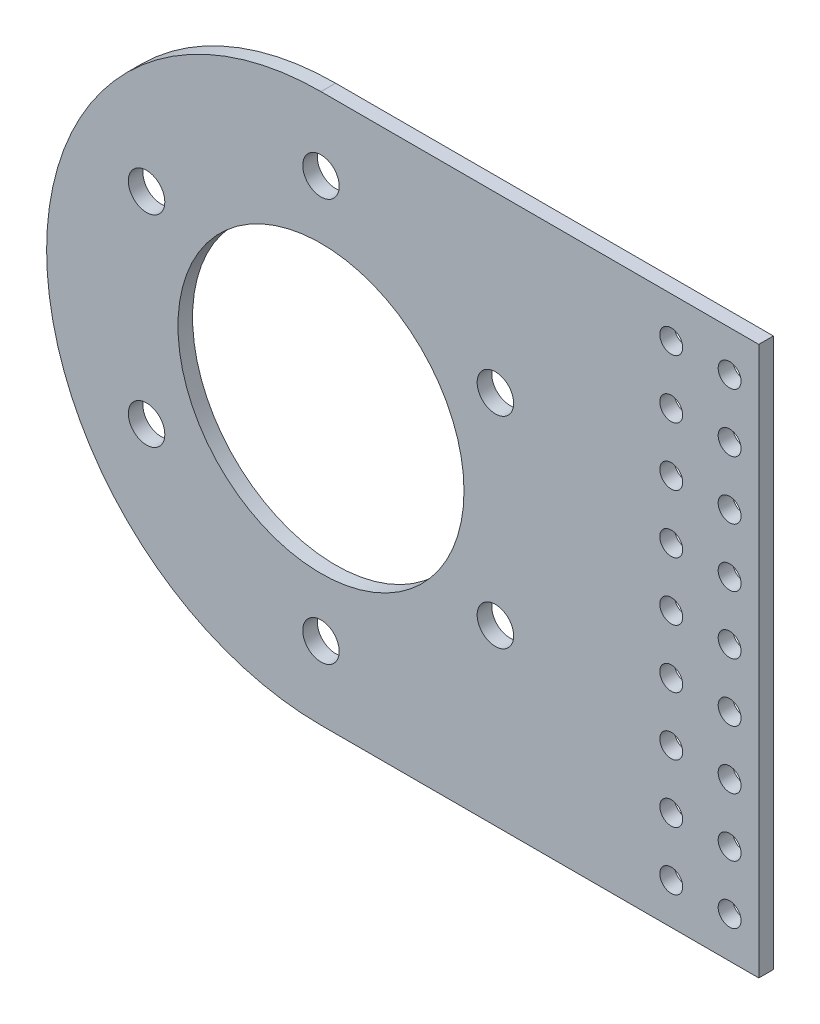
ISO-10303-21;
HEADER;
FILE_DESCRIPTION(('STEP AP214'),'2;1');
FILE_NAME('part.step','',(''),(''),'','','');
FILE_SCHEMA(('AUTOMOTIVE_DESIGN { 1 0 10303 214 1 1 1 1 }'));
ENDSEC;
DATA;
#1=APPLICATION_CONTEXT('core data for automotive mechanical design processes');
#2=APPLICATION_PROTOCOL_DEFINITION('international standard','automotive_design',2000,#1);
#3=PRODUCT_CONTEXT('',#1,'mechanical');
#4=PRODUCT('Part','Part','',(#3));
#5=PRODUCT_RELATED_PRODUCT_CATEGORY('part','',(#4));
#6=PRODUCT_DEFINITION_FORMATION('','',#4);
#7=PRODUCT_DEFINITION_CONTEXT('part definition',#1,'design');
#8=PRODUCT_DEFINITION('design','',#6,#7);
#9=PRODUCT_DEFINITION_SHAPE('','',#8);
#10=(LENGTH_UNIT() NAMED_UNIT(*) SI_UNIT(.MILLI.,.METRE.));
#11=(NAMED_UNIT(*) PLANE_ANGLE_UNIT() SI_UNIT($,.RADIAN.));
#12=(NAMED_UNIT(*) SI_UNIT($,.STERADIAN.) SOLID_ANGLE_UNIT());
#13=UNCERTAINTY_MEASURE_WITH_UNIT(LENGTH_MEASURE(1.E-05),#10,'distance_accuracy_value','');
#14=(GEOMETRIC_REPRESENTATION_CONTEXT(3) GLOBAL_UNCERTAINTY_ASSIGNED_CONTEXT((#13)) GLOBAL_UNIT_ASSIGNED_CONTEXT((#10,
#11,#12)) REPRESENTATION_CONTEXT('',''));
#15=CARTESIAN_POINT('',(0.,0.,0.));
#16=DIRECTION('',(0.,0.,1.));
#17=DIRECTION('',(1.,0.,0.));
#18=AXIS2_PLACEMENT_3D('',#15,#16,#17);
#19=CARTESIAN_POINT('',(0.,0.,3.175));
#20=DIRECTION('',(0.,0.,1.));
#21=DIRECTION('',(1.,0.,0.));
#22=AXIS2_PLACEMENT_3D('',#19,#20,#21);
#23=PLANE('',#22);
#24=CARTESIAN_POINT('',(37.9449030668154,21.9074999999996,3.175));
#25=DIRECTION('',(0.,0.,1.));
#26=DIRECTION('',(1.,0.,0.));
#27=AXIS2_PLACEMENT_3D('',#24,#25,#26);
#28=CIRCLE('',#27,3.96875);
#29=CARTESIAN_POINT('',(41.9136530668154,21.9074999999996,3.175));
#30=VERTEX_POINT('',#29);
#31=EDGE_CURVE('E331',#30,#30,#28,.T.);
#32=ORIENTED_EDGE('',*,*,#31,.F.);
#33=EDGE_LOOP('',(#32));
#34=FACE_BOUND('',#33,.T.);
#35=CARTESIAN_POINT('',(37.9449030668149,-21.9075000000004,3.175));
#36=DIRECTION('',(0.,0.,1.));
#37=DIRECTION('',(1.,0.,0.));
#38=AXIS2_PLACEMENT_3D('',#35,#36,#37);
#39=CIRCLE('',#38,3.96875);
#40=CARTESIAN_POINT('',(41.9136530668149,-21.9075000000004,3.175));
#41=VERTEX_POINT('',#40);
#42=EDGE_CURVE('E323',#41,#41,#39,.T.);
#43=ORIENTED_EDGE('',*,*,#42,.F.);
#44=EDGE_LOOP('',(#43));
#45=FACE_BOUND('',#44,.T.);
#46=CARTESIAN_POINT('',(0.,-43.815,3.175));
#47=DIRECTION('',(0.,0.,1.));
#48=DIRECTION('',(1.,0.,0.));
#49=AXIS2_PLACEMENT_3D('',#46,#47,#48);
#50=CIRCLE('',#49,3.96875);
#51=CARTESIAN_POINT('',(3.96875,-43.815,3.175));
#52=VERTEX_POINT('',#51);
#53=EDGE_CURVE('E315',#52,#52,#50,.T.);
#54=ORIENTED_EDGE('',*,*,#53,.F.);
#55=EDGE_LOOP('',(#54));
#56=FACE_BOUND('',#55,.T.);
#57=CARTESIAN_POINT('',(-37.9449030668152,-21.9074999999999,3.175));
#58=DIRECTION('',(0.,0.,1.));
#59=DIRECTION('',(1.,0.,0.));
#60=AXIS2_PLACEMENT_3D('',#57,#58,#59);
#61=CIRCLE('',#60,3.96875);
#62=CARTESIAN_POINT('',(-33.9761530668152,-21.9074999999999,3.175));
#63=VERTEX_POINT('',#62);
#64=EDGE_CURVE('E307',#63,#63,#61,.T.);
#65=ORIENTED_EDGE('',*,*,#64,.F.);
#66=EDGE_LOOP('',(#65));
#67=FACE_BOUND('',#66,.T.);
#68=CARTESIAN_POINT('',(-37.9449030668151,21.9075000000002,3.175));
#69=DIRECTION('',(0.,0.,1.));
#70=DIRECTION('',(1.,0.,0.));
#71=AXIS2_PLACEMENT_3D('',#68,#69,#70);
#72=CIRCLE('',#71,3.96875);
#73=CARTESIAN_POINT('',(-33.9761530668151,21.9075000000002,3.175));
#74=VERTEX_POINT('',#73);
#75=EDGE_CURVE('E299',#74,#74,#72,.T.);
#76=ORIENTED_EDGE('',*,*,#75,.F.);
#77=EDGE_LOOP('',(#76));
#78=FACE_BOUND('',#77,.T.);
#79=CARTESIAN_POINT('',(3.05958509722824E-13,43.815,3.175));
#80=DIRECTION('',(0.,0.,1.));
#81=DIRECTION('',(1.,0.,0.));
#82=AXIS2_PLACEMENT_3D('',#79,#80,#81);
#83=CIRCLE('',#82,3.96875);
#84=CARTESIAN_POINT('',(3.96875000000031,43.815,3.175));
#85=VERTEX_POINT('',#84);
#86=EDGE_CURVE('E291',#85,#85,#83,.T.);
#87=ORIENTED_EDGE('',*,*,#86,.F.);
#88=EDGE_LOOP('',(#87));
#89=FACE_BOUND('',#88,.T.);
#90=CARTESIAN_POINT('',(88.9,-50.8,3.175));
#91=DIRECTION('',(0.,0.,1.));
#92=DIRECTION('',(1.,0.,0.));
#93=AXIS2_PLACEMENT_3D('',#90,#91,#92);
#94=CIRCLE('',#93,2.4892);
#95=CARTESIAN_POINT('',(91.3892,-50.8,3.175));
#96=VERTEX_POINT('',#95);
#97=EDGE_CURVE('E283',#96,#96,#94,.T.);
#98=ORIENTED_EDGE('',*,*,#97,.F.);
#99=EDGE_LOOP('',(#98));
#100=FACE_BOUND('',#99,.T.);
#101=CARTESIAN_POINT('',(76.2,-50.8000000000001,3.175));
#102=DIRECTION('',(0.,0.,1.));
#103=DIRECTION('',(1.,0.,0.));
#104=AXIS2_PLACEMENT_3D('',#101,#102,#103);
#105=CIRCLE('',#104,2.4892);
#106=CARTESIAN_POINT('',(78.6892,-50.8000000000001,3.175));
#107=VERTEX_POINT('',#106);
#108=EDGE_CURVE('E275',#107,#107,#105,.T.);
#109=ORIENTED_EDGE('',*,*,#108,.F.);
#110=EDGE_LOOP('',(#109));
#111=FACE_BOUND('',#110,.T.);
#112=CARTESIAN_POINT('',(76.2,-38.1000000000001,3.175));
#113=DIRECTION('',(0.,0.,1.));
#114=DIRECTION('',(1.,0.,0.));
#115=AXIS2_PLACEMENT_3D('',#112,#113,#114);
#116=CIRCLE('',#115,2.4892);
#117=CARTESIAN_POINT('',(78.6892,-38.1000000000001,3.175));
#118=VERTEX_POINT('',#117);
#119=EDGE_CURVE('E267',#118,#118,#116,.T.);
#120=ORIENTED_EDGE('',*,*,#119,.F.);
#121=EDGE_LOOP('',(#120));
#122=FACE_BOUND('',#121,.T.);
#123=CARTESIAN_POINT('',(76.2,-25.4000000000001,3.175));
#124=DIRECTION('',(0.,0.,1.));
#125=DIRECTION('',(1.,0.,0.));
#126=AXIS2_PLACEMENT_3D('',#123,#124,#125);
#127=CIRCLE('',#126,2.4892);
#128=CARTESIAN_POINT('',(78.6892,-25.4000000000001,3.175));
#129=VERTEX_POINT('',#128);
#130=EDGE_CURVE('E259',#129,#129,#127,.T.);
#131=ORIENTED_EDGE('',*,*,#130,.F.);
#132=EDGE_LOOP('',(#131));
#133=FACE_BOUND('',#132,.T.);
#134=CARTESIAN_POINT('',(76.2,-12.7000000000001,3.175));
#135=DIRECTION('',(0.,0.,1.));
#136=DIRECTION('',(1.,0.,0.));
#137=AXIS2_PLACEMENT_3D('',#134,#135,#136);
#138=CIRCLE('',#137,2.4892);
#139=CARTESIAN_POINT('',(78.6892,-12.7000000000001,3.175));
#140=VERTEX_POINT('',#139);
#141=EDGE_CURVE('E251',#140,#140,#138,.T.);
#142=ORIENTED_EDGE('',*,*,#141,.F.);
#143=EDGE_LOOP('',(#142));
#144=FACE_BOUND('',#143,.T.);
#145=CARTESIAN_POINT('',(76.2,0.,3.175));
#146=DIRECTION('',(0.,0.,1.));
#147=DIRECTION('',(1.,0.,0.));
#148=AXIS2_PLACEMENT_3D('',#145,#146,#147);
#149=CIRCLE('',#148,2.4892);
#150=CARTESIAN_POINT('',(78.6892,0.,3.175));
#151=VERTEX_POINT('',#150);
#152=EDGE_CURVE('E243',#151,#151,#149,.T.);
#153=ORIENTED_EDGE('',*,*,#152,.F.);
#154=EDGE_LOOP('',(#153));
#155=FACE_BOUND('',#154,.T.);
#156=CARTESIAN_POINT('',(76.2,12.6999999999999,3.175));
#157=DIRECTION('',(0.,0.,1.));
#158=DIRECTION('',(1.,0.,0.));
#159=AXIS2_PLACEMENT_3D('',#156,#157,#158);
#160=CIRCLE('',#159,2.4892);
#161=CARTESIAN_POINT('',(78.6892,12.6999999999999,3.175));
#162=VERTEX_POINT('',#161);
#163=EDGE_CURVE('E235',#162,#162,#160,.T.);
#164=ORIENTED_EDGE('',*,*,#163,.F.);
#165=EDGE_LOOP('',(#164));
#166=FACE_BOUND('',#165,.T.);
#167=CARTESIAN_POINT('',(76.2,25.3999999999999,3.175));
#168=DIRECTION('',(0.,0.,1.));
#169=DIRECTION('',(1.,0.,0.));
#170=AXIS2_PLACEMENT_3D('',#167,#168,#169);
#171=CIRCLE('',#170,2.4892);
#172=CARTESIAN_POINT('',(78.6892,25.3999999999999,3.175));
#173=VERTEX_POINT('',#172);
#174=EDGE_CURVE('E227',#173,#173,#171,.T.);
#175=ORIENTED_EDGE('',*,*,#174,.F.);
#176=EDGE_LOOP('',(#175));
#177=FACE_BOUND('',#176,.T.);
#178=CARTESIAN_POINT('',(76.2,38.0999999999999,3.175));
#179=DIRECTION('',(0.,0.,1.));
#180=DIRECTION('',(1.,0.,0.));
#181=AXIS2_PLACEMENT_3D('',#178,#179,#180);
#182=CIRCLE('',#181,2.4892);
#183=CARTESIAN_POINT('',(78.6892,38.0999999999999,3.175));
#184=VERTEX_POINT('',#183);
#185=EDGE_CURVE('E219',#184,#184,#182,.T.);
#186=ORIENTED_EDGE('',*,*,#185,.F.);
#187=EDGE_LOOP('',(#186));
#188=FACE_BOUND('',#187,.T.);
#189=CARTESIAN_POINT('',(76.2,50.7999999999999,3.175));
#190=DIRECTION('',(0.,0.,1.));
#191=DIRECTION('',(1.,0.,0.));
#192=AXIS2_PLACEMENT_3D('',#189,#190,#191);
#193=CIRCLE('',#192,2.4892);
#194=CARTESIAN_POINT('',(78.6892,50.7999999999999,3.175));
#195=VERTEX_POINT('',#194);
#196=EDGE_CURVE('E211',#195,#195,#193,.T.);
#197=ORIENTED_EDGE('',*,*,#196,.F.);
#198=EDGE_LOOP('',(#197));
#199=FACE_BOUND('',#198,.T.);
#200=CARTESIAN_POINT('',(88.9,-38.1,3.175));
#201=DIRECTION('',(0.,0.,1.));
#202=DIRECTION('',(1.,0.,0.));
#203=AXIS2_PLACEMENT_3D('',#200,#201,#202);
#204=CIRCLE('',#203,2.4892);
#205=CARTESIAN_POINT('',(91.3892,-38.1,3.175));
#206=VERTEX_POINT('',#205);
#207=EDGE_CURVE('E203',#206,#206,#204,.T.);
#208=ORIENTED_EDGE('',*,*,#207,.F.);
#209=EDGE_LOOP('',(#208));
#210=FACE_BOUND('',#209,.T.);
#211=CARTESIAN_POINT('',(88.9,-25.4,3.175));
#212=DIRECTION('',(0.,0.,1.));
#213=DIRECTION('',(1.,0.,0.));
#214=AXIS2_PLACEMENT_3D('',#211,#212,#213);
#215=CIRCLE('',#214,2.4892);
#216=CARTESIAN_POINT('',(91.3892,-25.4,3.175));
#217=VERTEX_POINT('',#216);
#218=EDGE_CURVE('E195',#217,#217,#215,.T.);
#219=ORIENTED_EDGE('',*,*,#218,.F.);
#220=EDGE_LOOP('',(#219));
#221=FACE_BOUND('',#220,.T.);
#222=CARTESIAN_POINT('',(88.9,-12.7,3.175));
#223=DIRECTION('',(0.,0.,1.));
#224=DIRECTION('',(1.,0.,0.));
#225=AXIS2_PLACEMENT_3D('',#222,#223,#224);
#226=CIRCLE('',#225,2.4892);
#227=CARTESIAN_POINT('',(91.3892,-12.7,3.175));
#228=VERTEX_POINT('',#227);
#229=EDGE_CURVE('E187',#228,#228,#226,.T.);
#230=ORIENTED_EDGE('',*,*,#229,.F.);
#231=EDGE_LOOP('',(#230));
#232=FACE_BOUND('',#231,.T.);
#233=CARTESIAN_POINT('',(88.9,0.,3.175));
#234=DIRECTION('',(0.,0.,1.));
#235=DIRECTION('',(1.,0.,0.));
#236=AXIS2_PLACEMENT_3D('',#233,#234,#235);
#237=CIRCLE('',#236,2.4892);
#238=CARTESIAN_POINT('',(91.3892,0.,3.175));
#239=VERTEX_POINT('',#238);
#240=EDGE_CURVE('E179',#239,#239,#237,.T.);
#241=ORIENTED_EDGE('',*,*,#240,.F.);
#242=EDGE_LOOP('',(#241));
#243=FACE_BOUND('',#242,.T.);
#244=CARTESIAN_POINT('',(88.9,12.7,3.175));
#245=DIRECTION('',(0.,0.,1.));
#246=DIRECTION('',(1.,0.,0.));
#247=AXIS2_PLACEMENT_3D('',#244,#245,#246);
#248=CIRCLE('',#247,2.4892);
#249=CARTESIAN_POINT('',(91.3892,12.7,3.175));
#250=VERTEX_POINT('',#249);
#251=EDGE_CURVE('E171',#250,#250,#248,.T.);
#252=ORIENTED_EDGE('',*,*,#251,.F.);
#253=EDGE_LOOP('',(#252));
#254=FACE_BOUND('',#253,.T.);
#255=CARTESIAN_POINT('',(88.9,25.4,3.175));
#256=DIRECTION('',(0.,0.,1.));
#257=DIRECTION('',(1.,0.,0.));
#258=AXIS2_PLACEMENT_3D('',#255,#256,#257);
#259=CIRCLE('',#258,2.4892);
#260=CARTESIAN_POINT('',(91.3892,25.4,3.175));
#261=VERTEX_POINT('',#260);
#262=EDGE_CURVE('E163',#261,#261,#259,.T.);
#263=ORIENTED_EDGE('',*,*,#262,.F.);
#264=EDGE_LOOP('',(#263));
#265=FACE_BOUND('',#264,.T.);
#266=CARTESIAN_POINT('',(88.9,38.1,3.175));
#267=DIRECTION('',(0.,0.,1.));
#268=DIRECTION('',(1.,0.,0.));
#269=AXIS2_PLACEMENT_3D('',#266,#267,#268);
#270=CIRCLE('',#269,2.4892);
#271=CARTESIAN_POINT('',(91.3892,38.1,3.175));
#272=VERTEX_POINT('',#271);
#273=EDGE_CURVE('E155',#272,#272,#270,.T.);
#274=ORIENTED_EDGE('',*,*,#273,.F.);
#275=EDGE_LOOP('',(#274));
#276=FACE_BOUND('',#275,.T.);
#277=CARTESIAN_POINT('',(88.9,50.8,3.175));
#278=DIRECTION('',(0.,0.,1.));
#279=DIRECTION('',(1.,0.,0.));
#280=AXIS2_PLACEMENT_3D('',#277,#278,#279);
#281=CIRCLE('',#280,2.4892);
#282=CARTESIAN_POINT('',(91.3892,50.8,3.175));
#283=VERTEX_POINT('',#282);
#284=EDGE_CURVE('E147',#283,#283,#281,.T.);
#285=ORIENTED_EDGE('',*,*,#284,.F.);
#286=EDGE_LOOP('',(#285));
#287=FACE_BOUND('',#286,.T.);
#288=CARTESIAN_POINT('',(0.,0.,3.175));
#289=DIRECTION('',(0.,0.,1.));
#290=DIRECTION('',(1.,0.,0.));
#291=AXIS2_PLACEMENT_3D('',#288,#289,#290);
#292=CIRCLE('',#291,59.69);
#293=CARTESIAN_POINT('',(0.,59.69,3.175));
#294=VERTEX_POINT('',#293);
#295=CARTESIAN_POINT('',(0.,-59.69,3.175));
#296=VERTEX_POINT('',#295);
#297=EDGE_CURVE('E98',#294,#296,#292,.T.);
#298=ORIENTED_EDGE('',*,*,#297,.T.);
#299=DIRECTION('',(1.,0.,0.));
#300=VECTOR('',#299,1.);
#301=CARTESIAN_POINT('',(0.,-59.69,3.175));
#302=LINE('',#301,#300);
#303=CARTESIAN_POINT('',(95.25,-59.69,3.175));
#304=VERTEX_POINT('',#303);
#305=EDGE_CURVE('E93',#296,#304,#302,.T.);
#306=ORIENTED_EDGE('',*,*,#305,.T.);
#307=DIRECTION('',(0.,1.,0.));
#308=VECTOR('',#307,1.);
#309=CARTESIAN_POINT('',(95.25,-59.69,3.175));
#310=LINE('',#309,#308);
#311=CARTESIAN_POINT('',(95.25,59.69,3.175));
#312=VERTEX_POINT('',#311);
#313=EDGE_CURVE('E96',#304,#312,#310,.T.);
#314=ORIENTED_EDGE('',*,*,#313,.T.);
#315=DIRECTION('',(-1.,0.,0.));
#316=VECTOR('',#315,1.);
#317=CARTESIAN_POINT('',(95.25,59.69,3.175));
#318=LINE('',#317,#316);
#319=EDGE_CURVE('E63',#312,#294,#318,.T.);
#320=ORIENTED_EDGE('',*,*,#319,.T.);
#321=EDGE_LOOP('',(#298,#306,#314,#320));
#322=FACE_BOUND('',#321,.T.);
#323=CARTESIAN_POINT('',(0.,0.,3.175));
#324=DIRECTION('',(0.,0.,1.));
#325=DIRECTION('',(1.,0.,0.));
#326=AXIS2_PLACEMENT_3D('',#323,#324,#325);
#327=CIRCLE('',#326,31.115);
#328=CARTESIAN_POINT('',(31.115,0.,3.175));
#329=VERTEX_POINT('',#328);
#330=EDGE_CURVE('E118',#329,#329,#327,.T.);
#331=ORIENTED_EDGE('',*,*,#330,.F.);
#332=EDGE_LOOP('',(#331));
#333=FACE_BOUND('',#332,.T.);
#334=ADVANCED_FACE('F45',(#34,#45,#56,#67,#78,#89,#100,#111,#122,#133,#144,#155,#166,#177,#188,
#199,#210,#221,#232,#243,#254,#265,#276,#287,#322,#333),#23,.T.);
#335=CARTESIAN_POINT('',(0.,0.,0.));
#336=DIRECTION('',(0.,0.,1.));
#337=DIRECTION('',(1.,0.,0.));
#338=AXIS2_PLACEMENT_3D('',#335,#336,#337);
#339=PLANE('',#338);
#340=CARTESIAN_POINT('',(37.9449030668154,21.9074999999996,0.));
#341=DIRECTION('',(0.,0.,1.));
#342=DIRECTION('',(1.,0.,0.));
#343=AXIS2_PLACEMENT_3D('',#340,#341,#342);
#344=CIRCLE('',#343,3.96875);
#345=CARTESIAN_POINT('',(41.9136530668154,21.9074999999996,0.));
#346=VERTEX_POINT('',#345);
#347=EDGE_CURVE('E327',#346,#346,#344,.T.);
#348=ORIENTED_EDGE('',*,*,#347,.T.);
#349=EDGE_LOOP('',(#348));
#350=FACE_BOUND('',#349,.T.);
#351=CARTESIAN_POINT('',(37.9449030668149,-21.9075000000004,0.));
#352=DIRECTION('',(0.,0.,1.));
#353=DIRECTION('',(1.,0.,0.));
#354=AXIS2_PLACEMENT_3D('',#351,#352,#353);
#355=CIRCLE('',#354,3.96875);
#356=CARTESIAN_POINT('',(41.9136530668149,-21.9075000000004,0.));
#357=VERTEX_POINT('',#356);
#358=EDGE_CURVE('E319',#357,#357,#355,.T.);
#359=ORIENTED_EDGE('',*,*,#358,.T.);
#360=EDGE_LOOP('',(#359));
#361=FACE_BOUND('',#360,.T.);
#362=CARTESIAN_POINT('',(0.,-43.815,0.));
#363=DIRECTION('',(0.,0.,1.));
#364=DIRECTION('',(1.,0.,0.));
#365=AXIS2_PLACEMENT_3D('',#362,#363,#364);
#366=CIRCLE('',#365,3.96875);
#367=CARTESIAN_POINT('',(3.96875,-43.815,0.));
#368=VERTEX_POINT('',#367);
#369=EDGE_CURVE('E311',#368,#368,#366,.T.);
#370=ORIENTED_EDGE('',*,*,#369,.T.);
#371=EDGE_LOOP('',(#370));
#372=FACE_BOUND('',#371,.T.);
#373=CARTESIAN_POINT('',(-37.9449030668152,-21.9074999999999,0.));
#374=DIRECTION('',(0.,0.,1.));
#375=DIRECTION('',(1.,0.,0.));
#376=AXIS2_PLACEMENT_3D('',#373,#374,#375);
#377=CIRCLE('',#376,3.96875);
#378=CARTESIAN_POINT('',(-33.9761530668152,-21.9074999999999,0.));
#379=VERTEX_POINT('',#378);
#380=EDGE_CURVE('E303',#379,#379,#377,.T.);
#381=ORIENTED_EDGE('',*,*,#380,.T.);
#382=EDGE_LOOP('',(#381));
#383=FACE_BOUND('',#382,.T.);
#384=CARTESIAN_POINT('',(-37.9449030668151,21.9075000000002,0.));
#385=DIRECTION('',(0.,0.,1.));
#386=DIRECTION('',(1.,0.,0.));
#387=AXIS2_PLACEMENT_3D('',#384,#385,#386);
#388=CIRCLE('',#387,3.96875);
#389=CARTESIAN_POINT('',(-33.9761530668151,21.9075000000002,0.));
#390=VERTEX_POINT('',#389);
#391=EDGE_CURVE('E295',#390,#390,#388,.T.);
#392=ORIENTED_EDGE('',*,*,#391,.T.);
#393=EDGE_LOOP('',(#392));
#394=FACE_BOUND('',#393,.T.);
#395=CARTESIAN_POINT('',(3.05958509722824E-13,43.815,0.));
#396=DIRECTION('',(0.,0.,1.));
#397=DIRECTION('',(1.,0.,0.));
#398=AXIS2_PLACEMENT_3D('',#395,#396,#397);
#399=CIRCLE('',#398,3.96875);
#400=CARTESIAN_POINT('',(3.96875000000031,43.815,0.));
#401=VERTEX_POINT('',#400);
#402=EDGE_CURVE('E287',#401,#401,#399,.T.);
#403=ORIENTED_EDGE('',*,*,#402,.T.);
#404=EDGE_LOOP('',(#403));
#405=FACE_BOUND('',#404,.T.);
#406=CARTESIAN_POINT('',(88.9,-50.8,0.));
#407=DIRECTION('',(0.,0.,1.));
#408=DIRECTION('',(1.,0.,0.));
#409=AXIS2_PLACEMENT_3D('',#406,#407,#408);
#410=CIRCLE('',#409,2.4892);
#411=CARTESIAN_POINT('',(91.3892,-50.8,0.));
#412=VERTEX_POINT('',#411);
#413=EDGE_CURVE('E279',#412,#412,#410,.T.);
#414=ORIENTED_EDGE('',*,*,#413,.T.);
#415=EDGE_LOOP('',(#414));
#416=FACE_BOUND('',#415,.T.);
#417=CARTESIAN_POINT('',(76.2,-50.8000000000001,0.));
#418=DIRECTION('',(0.,0.,1.));
#419=DIRECTION('',(1.,0.,0.));
#420=AXIS2_PLACEMENT_3D('',#417,#418,#419);
#421=CIRCLE('',#420,2.4892);
#422=CARTESIAN_POINT('',(78.6892,-50.8000000000001,0.));
#423=VERTEX_POINT('',#422);
#424=EDGE_CURVE('E271',#423,#423,#421,.T.);
#425=ORIENTED_EDGE('',*,*,#424,.T.);
#426=EDGE_LOOP('',(#425));
#427=FACE_BOUND('',#426,.T.);
#428=CARTESIAN_POINT('',(76.2,-38.1000000000001,0.));
#429=DIRECTION('',(0.,0.,1.));
#430=DIRECTION('',(1.,0.,0.));
#431=AXIS2_PLACEMENT_3D('',#428,#429,#430);
#432=CIRCLE('',#431,2.4892);
#433=CARTESIAN_POINT('',(78.6892,-38.1000000000001,0.));
#434=VERTEX_POINT('',#433);
#435=EDGE_CURVE('E263',#434,#434,#432,.T.);
#436=ORIENTED_EDGE('',*,*,#435,.T.);
#437=EDGE_LOOP('',(#436));
#438=FACE_BOUND('',#437,.T.);
#439=CARTESIAN_POINT('',(76.2,-25.4000000000001,0.));
#440=DIRECTION('',(0.,0.,1.));
#441=DIRECTION('',(1.,0.,0.));
#442=AXIS2_PLACEMENT_3D('',#439,#440,#441);
#443=CIRCLE('',#442,2.4892);
#444=CARTESIAN_POINT('',(78.6892,-25.4000000000001,0.));
#445=VERTEX_POINT('',#444);
#446=EDGE_CURVE('E255',#445,#445,#443,.T.);
#447=ORIENTED_EDGE('',*,*,#446,.T.);
#448=EDGE_LOOP('',(#447));
#449=FACE_BOUND('',#448,.T.);
#450=CARTESIAN_POINT('',(76.2,-12.7000000000001,0.));
#451=DIRECTION('',(0.,0.,1.));
#452=DIRECTION('',(1.,0.,0.));
#453=AXIS2_PLACEMENT_3D('',#450,#451,#452);
#454=CIRCLE('',#453,2.4892);
#455=CARTESIAN_POINT('',(78.6892,-12.7000000000001,0.));
#456=VERTEX_POINT('',#455);
#457=EDGE_CURVE('E247',#456,#456,#454,.T.);
#458=ORIENTED_EDGE('',*,*,#457,.T.);
#459=EDGE_LOOP('',(#458));
#460=FACE_BOUND('',#459,.T.);
#461=CARTESIAN_POINT('',(76.2,0.,0.));
#462=DIRECTION('',(0.,0.,1.));
#463=DIRECTION('',(1.,0.,0.));
#464=AXIS2_PLACEMENT_3D('',#461,#462,#463);
#465=CIRCLE('',#464,2.4892);
#466=CARTESIAN_POINT('',(78.6892,0.,0.));
#467=VERTEX_POINT('',#466);
#468=EDGE_CURVE('E239',#467,#467,#465,.T.);
#469=ORIENTED_EDGE('',*,*,#468,.T.);
#470=EDGE_LOOP('',(#469));
#471=FACE_BOUND('',#470,.T.);
#472=CARTESIAN_POINT('',(76.2,12.6999999999999,0.));
#473=DIRECTION('',(0.,0.,1.));
#474=DIRECTION('',(1.,0.,0.));
#475=AXIS2_PLACEMENT_3D('',#472,#473,#474);
#476=CIRCLE('',#475,2.4892);
#477=CARTESIAN_POINT('',(78.6892,12.6999999999999,0.));
#478=VERTEX_POINT('',#477);
#479=EDGE_CURVE('E231',#478,#478,#476,.T.);
#480=ORIENTED_EDGE('',*,*,#479,.T.);
#481=EDGE_LOOP('',(#480));
#482=FACE_BOUND('',#481,.T.);
#483=CARTESIAN_POINT('',(76.2,25.3999999999999,0.));
#484=DIRECTION('',(0.,0.,1.));
#485=DIRECTION('',(1.,0.,0.));
#486=AXIS2_PLACEMENT_3D('',#483,#484,#485);
#487=CIRCLE('',#486,2.4892);
#488=CARTESIAN_POINT('',(78.6892,25.3999999999999,0.));
#489=VERTEX_POINT('',#488);
#490=EDGE_CURVE('E223',#489,#489,#487,.T.);
#491=ORIENTED_EDGE('',*,*,#490,.T.);
#492=EDGE_LOOP('',(#491));
#493=FACE_BOUND('',#492,.T.);
#494=CARTESIAN_POINT('',(76.2,38.0999999999999,0.));
#495=DIRECTION('',(0.,0.,1.));
#496=DIRECTION('',(1.,0.,0.));
#497=AXIS2_PLACEMENT_3D('',#494,#495,#496);
#498=CIRCLE('',#497,2.4892);
#499=CARTESIAN_POINT('',(78.6892,38.0999999999999,0.));
#500=VERTEX_POINT('',#499);
#501=EDGE_CURVE('E215',#500,#500,#498,.T.);
#502=ORIENTED_EDGE('',*,*,#501,.T.);
#503=EDGE_LOOP('',(#502));
#504=FACE_BOUND('',#503,.T.);
#505=CARTESIAN_POINT('',(76.2,50.7999999999999,0.));
#506=DIRECTION('',(0.,0.,1.));
#507=DIRECTION('',(1.,0.,0.));
#508=AXIS2_PLACEMENT_3D('',#505,#506,#507);
#509=CIRCLE('',#508,2.4892);
#510=CARTESIAN_POINT('',(78.6892,50.7999999999999,0.));
#511=VERTEX_POINT('',#510);
#512=EDGE_CURVE('E207',#511,#511,#509,.T.);
#513=ORIENTED_EDGE('',*,*,#512,.T.);
#514=EDGE_LOOP('',(#513));
#515=FACE_BOUND('',#514,.T.);
#516=CARTESIAN_POINT('',(88.9,-38.1,0.));
#517=DIRECTION('',(0.,0.,1.));
#518=DIRECTION('',(1.,0.,0.));
#519=AXIS2_PLACEMENT_3D('',#516,#517,#518);
#520=CIRCLE('',#519,2.4892);
#521=CARTESIAN_POINT('',(91.3892,-38.1,0.));
#522=VERTEX_POINT('',#521);
#523=EDGE_CURVE('E199',#522,#522,#520,.T.);
#524=ORIENTED_EDGE('',*,*,#523,.T.);
#525=EDGE_LOOP('',(#524));
#526=FACE_BOUND('',#525,.T.);
#527=CARTESIAN_POINT('',(88.9,-25.4,0.));
#528=DIRECTION('',(0.,0.,1.));
#529=DIRECTION('',(1.,0.,0.));
#530=AXIS2_PLACEMENT_3D('',#527,#528,#529);
#531=CIRCLE('',#530,2.4892);
#532=CARTESIAN_POINT('',(91.3892,-25.4,0.));
#533=VERTEX_POINT('',#532);
#534=EDGE_CURVE('E191',#533,#533,#531,.T.);
#535=ORIENTED_EDGE('',*,*,#534,.T.);
#536=EDGE_LOOP('',(#535));
#537=FACE_BOUND('',#536,.T.);
#538=CARTESIAN_POINT('',(88.9,-12.7,0.));
#539=DIRECTION('',(0.,0.,1.));
#540=DIRECTION('',(1.,0.,0.));
#541=AXIS2_PLACEMENT_3D('',#538,#539,#540);
#542=CIRCLE('',#541,2.4892);
#543=CARTESIAN_POINT('',(91.3892,-12.7,0.));
#544=VERTEX_POINT('',#543);
#545=EDGE_CURVE('E183',#544,#544,#542,.T.);
#546=ORIENTED_EDGE('',*,*,#545,.T.);
#547=EDGE_LOOP('',(#546));
#548=FACE_BOUND('',#547,.T.);
#549=CARTESIAN_POINT('',(88.9,0.,0.));
#550=DIRECTION('',(0.,0.,1.));
#551=DIRECTION('',(1.,0.,0.));
#552=AXIS2_PLACEMENT_3D('',#549,#550,#551);
#553=CIRCLE('',#552,2.4892);
#554=CARTESIAN_POINT('',(91.3892,0.,0.));
#555=VERTEX_POINT('',#554);
#556=EDGE_CURVE('E175',#555,#555,#553,.T.);
#557=ORIENTED_EDGE('',*,*,#556,.T.);
#558=EDGE_LOOP('',(#557));
#559=FACE_BOUND('',#558,.T.);
#560=CARTESIAN_POINT('',(88.9,12.7,0.));
#561=DIRECTION('',(0.,0.,1.));
#562=DIRECTION('',(1.,0.,0.));
#563=AXIS2_PLACEMENT_3D('',#560,#561,#562);
#564=CIRCLE('',#563,2.4892);
#565=CARTESIAN_POINT('',(91.3892,12.7,0.));
#566=VERTEX_POINT('',#565);
#567=EDGE_CURVE('E167',#566,#566,#564,.T.);
#568=ORIENTED_EDGE('',*,*,#567,.T.);
#569=EDGE_LOOP('',(#568));
#570=FACE_BOUND('',#569,.T.);
#571=CARTESIAN_POINT('',(88.9,25.4,0.));
#572=DIRECTION('',(0.,0.,1.));
#573=DIRECTION('',(1.,0.,0.));
#574=AXIS2_PLACEMENT_3D('',#571,#572,#573);
#575=CIRCLE('',#574,2.4892);
#576=CARTESIAN_POINT('',(91.3892,25.4,0.));
#577=VERTEX_POINT('',#576);
#578=EDGE_CURVE('E159',#577,#577,#575,.T.);
#579=ORIENTED_EDGE('',*,*,#578,.T.);
#580=EDGE_LOOP('',(#579));
#581=FACE_BOUND('',#580,.T.);
#582=CARTESIAN_POINT('',(88.9,38.1,0.));
#583=DIRECTION('',(0.,0.,1.));
#584=DIRECTION('',(1.,0.,0.));
#585=AXIS2_PLACEMENT_3D('',#582,#583,#584);
#586=CIRCLE('',#585,2.4892);
#587=CARTESIAN_POINT('',(91.3892,38.1,0.));
#588=VERTEX_POINT('',#587);
#589=EDGE_CURVE('E151',#588,#588,#586,.T.);
#590=ORIENTED_EDGE('',*,*,#589,.T.);
#591=EDGE_LOOP('',(#590));
#592=FACE_BOUND('',#591,.T.);
#593=CARTESIAN_POINT('',(88.9,50.8,0.));
#594=DIRECTION('',(0.,0.,1.));
#595=DIRECTION('',(1.,0.,0.));
#596=AXIS2_PLACEMENT_3D('',#593,#594,#595);
#597=CIRCLE('',#596,2.4892);
#598=CARTESIAN_POINT('',(91.3892,50.8,0.));
#599=VERTEX_POINT('',#598);
#600=EDGE_CURVE('E140',#599,#599,#597,.T.);
#601=ORIENTED_EDGE('',*,*,#600,.T.);
#602=EDGE_LOOP('',(#601));
#603=FACE_BOUND('',#602,.T.);
#604=CARTESIAN_POINT('',(0.,0.,0.));
#605=DIRECTION('',(0.,0.,1.));
#606=DIRECTION('',(1.,0.,0.));
#607=AXIS2_PLACEMENT_3D('',#604,#605,#606);
#608=CIRCLE('',#607,59.69);
#609=CARTESIAN_POINT('',(0.,59.69,0.));
#610=VERTEX_POINT('',#609);
#611=CARTESIAN_POINT('',(0.,-59.69,0.));
#612=VERTEX_POINT('',#611);
#613=EDGE_CURVE('E114',#610,#612,#608,.T.);
#614=ORIENTED_EDGE('',*,*,#613,.F.);
#615=DIRECTION('',(-1.,0.,0.));
#616=VECTOR('',#615,1.);
#617=CARTESIAN_POINT('',(95.25,59.69,0.));
#618=LINE('',#617,#616);
#619=CARTESIAN_POINT('',(95.25,59.69,0.));
#620=VERTEX_POINT('',#619);
#621=EDGE_CURVE('E86',#620,#610,#618,.T.);
#622=ORIENTED_EDGE('',*,*,#621,.F.);
#623=DIRECTION('',(0.,1.,0.));
#624=VECTOR('',#623,1.);
#625=CARTESIAN_POINT('',(95.25,-59.69,0.));
#626=LINE('',#625,#624);
#627=CARTESIAN_POINT('',(95.25,-59.69,0.));
#628=VERTEX_POINT('',#627);
#629=EDGE_CURVE('E80',#628,#620,#626,.T.);
#630=ORIENTED_EDGE('',*,*,#629,.F.);
#631=DIRECTION('',(1.,0.,0.));
#632=VECTOR('',#631,1.);
#633=CARTESIAN_POINT('',(0.,-59.69,0.));
#634=LINE('',#633,#632);
#635=EDGE_CURVE('E103',#612,#628,#634,.T.);
#636=ORIENTED_EDGE('',*,*,#635,.F.);
#637=EDGE_LOOP('',(#614,#622,#630,#636));
#638=FACE_BOUND('',#637,.T.);
#639=CARTESIAN_POINT('',(0.,0.,0.));
#640=DIRECTION('',(0.,0.,1.));
#641=DIRECTION('',(1.,0.,0.));
#642=AXIS2_PLACEMENT_3D('',#639,#640,#641);
#643=CIRCLE('',#642,31.115);
#644=CARTESIAN_POINT('',(31.115,0.,0.));
#645=VERTEX_POINT('',#644);
#646=EDGE_CURVE('E136',#645,#645,#643,.T.);
#647=ORIENTED_EDGE('',*,*,#646,.T.);
#648=EDGE_LOOP('',(#647));
#649=FACE_BOUND('',#648,.T.);
#650=ADVANCED_FACE('F131',(#350,#361,#372,#383,#394,#405,#416,#427,#438,#449,#460,#471,#482,
#493,#504,#515,#526,#537,#548,#559,#570,#581,#592,#603,#638,#649),#339,.F.);
#651=CARTESIAN_POINT('',(0.,0.,3.175));
#652=DIRECTION('',(0.,0.,-1.));
#653=DIRECTION('',(-1.,0.,0.));
#654=AXIS2_PLACEMENT_3D('',#651,#652,#653);
#655=CYLINDRICAL_SURFACE('',#654,59.69);
#656=ORIENTED_EDGE('',*,*,#613,.T.);
#657=DIRECTION('',(0.,0.,-1.));
#658=VECTOR('',#657,1.);
#659=CARTESIAN_POINT('',(0.,-59.69,3.175));
#660=LINE('',#659,#658);
#661=EDGE_CURVE('E11',#296,#612,#660,.T.);
#662=ORIENTED_EDGE('',*,*,#661,.F.);
#663=ORIENTED_EDGE('',*,*,#297,.F.);
#664=DIRECTION('',(0.,0.,-1.));
#665=VECTOR('',#664,1.);
#666=CARTESIAN_POINT('',(0.,59.69,3.175));
#667=LINE('',#666,#665);
#668=EDGE_CURVE('E110',#294,#610,#667,.T.);
#669=ORIENTED_EDGE('',*,*,#668,.T.);
#670=EDGE_LOOP('',(#656,#662,#663,#669));
#671=FACE_BOUND('',#670,.T.);
#672=ADVANCED_FACE('F47',(#671),#655,.T.);
#673=CARTESIAN_POINT('',(0.,-59.69,3.175));
#674=DIRECTION('',(0.,1.,0.));
#675=DIRECTION('',(-1.,0.,0.));
#676=AXIS2_PLACEMENT_3D('',#673,#674,#675);
#677=PLANE('',#676);
#678=ORIENTED_EDGE('',*,*,#635,.T.);
#679=DIRECTION('',(0.,0.,-1.));
#680=VECTOR('',#679,1.);
#681=CARTESIAN_POINT('',(95.25,-59.69,3.175));
#682=LINE('',#681,#680);
#683=EDGE_CURVE('E55',#304,#628,#682,.T.);
#684=ORIENTED_EDGE('',*,*,#683,.F.);
#685=ORIENTED_EDGE('',*,*,#305,.F.);
#686=ORIENTED_EDGE('',*,*,#661,.T.);
#687=EDGE_LOOP('',(#678,#684,#685,#686));
#688=FACE_BOUND('',#687,.T.);
#689=ADVANCED_FACE('F102',(#688),#677,.F.);
#690=CARTESIAN_POINT('',(95.25,-59.69,3.175));
#691=DIRECTION('',(-1.,0.,0.));
#692=DIRECTION('',(0.,0.,1.));
#693=AXIS2_PLACEMENT_3D('',#690,#691,#692);
#694=PLANE('',#693);
#695=ORIENTED_EDGE('',*,*,#629,.T.);
#696=DIRECTION('',(0.,0.,-1.));
#697=VECTOR('',#696,1.);
#698=CARTESIAN_POINT('',(95.25,59.69,3.175));
#699=LINE('',#698,#697);
#700=EDGE_CURVE('E105',#312,#620,#699,.T.);
#701=ORIENTED_EDGE('',*,*,#700,.F.);
#702=ORIENTED_EDGE('',*,*,#313,.F.);
#703=ORIENTED_EDGE('',*,*,#683,.T.);
#704=EDGE_LOOP('',(#695,#701,#702,#703));
#705=FACE_BOUND('',#704,.T.);
#706=ADVANCED_FACE('F106',(#705),#694,.F.);
#707=CARTESIAN_POINT('',(95.25,59.69,3.175));
#708=DIRECTION('',(0.,-1.,0.));
#709=DIRECTION('',(1.,0.,0.));
#710=AXIS2_PLACEMENT_3D('',#707,#708,#709);
#711=PLANE('',#710);
#712=ORIENTED_EDGE('',*,*,#621,.T.);
#713=ORIENTED_EDGE('',*,*,#668,.F.);
#714=ORIENTED_EDGE('',*,*,#319,.F.);
#715=ORIENTED_EDGE('',*,*,#700,.T.);
#716=EDGE_LOOP('',(#712,#713,#714,#715));
#717=FACE_BOUND('',#716,.T.);
#718=ADVANCED_FACE('F128',(#717),#711,.F.);
#719=CARTESIAN_POINT('',(0.,0.,3.175));
#720=DIRECTION('',(0.,0.,-1.));
#721=DIRECTION('',(-1.,0.,0.));
#722=AXIS2_PLACEMENT_3D('',#719,#720,#721);
#723=CYLINDRICAL_SURFACE('',#722,31.115);
#724=ORIENTED_EDGE('',*,*,#330,.T.);
#725=EDGE_LOOP('',(#724));
#726=FACE_BOUND('',#725,.T.);
#727=ORIENTED_EDGE('',*,*,#646,.F.);
#728=EDGE_LOOP('',(#727));
#729=FACE_BOUND('',#728,.T.);
#730=ADVANCED_FACE('F390',(#726,#729),#723,.F.);
#731=CARTESIAN_POINT('',(88.9,50.8,3.175));
#732=DIRECTION('',(0.,0.,1.));
#733=DIRECTION('',(1.,0.,0.));
#734=AXIS2_PLACEMENT_3D('',#731,#732,#733);
#735=CYLINDRICAL_SURFACE('',#734,2.4892);
#736=ORIENTED_EDGE('',*,*,#600,.F.);
#737=EDGE_LOOP('',(#736));
#738=FACE_BOUND('',#737,.T.);
#739=ORIENTED_EDGE('',*,*,#284,.T.);
#740=EDGE_LOOP('',(#739));
#741=FACE_BOUND('',#740,.T.);
#742=ADVANCED_FACE('F387',(#738,#741),#735,.F.);
#743=CARTESIAN_POINT('',(88.9,38.1,3.175));
#744=DIRECTION('',(0.,0.,1.));
#745=DIRECTION('',(1.,0.,0.));
#746=AXIS2_PLACEMENT_3D('',#743,#744,#745);
#747=CYLINDRICAL_SURFACE('',#746,2.4892);
#748=ORIENTED_EDGE('',*,*,#589,.F.);
#749=EDGE_LOOP('',(#748));
#750=FACE_BOUND('',#749,.T.);
#751=ORIENTED_EDGE('',*,*,#273,.T.);
#752=EDGE_LOOP('',(#751));
#753=FACE_BOUND('',#752,.T.);
#754=ADVANCED_FACE('F389',(#750,#753),#747,.F.);
#755=CARTESIAN_POINT('',(88.9,25.4,3.175));
#756=DIRECTION('',(0.,0.,1.));
#757=DIRECTION('',(1.,0.,0.));
#758=AXIS2_PLACEMENT_3D('',#755,#756,#757);
#759=CYLINDRICAL_SURFACE('',#758,2.4892);
#760=ORIENTED_EDGE('',*,*,#578,.F.);
#761=EDGE_LOOP('',(#760));
#762=FACE_BOUND('',#761,.T.);
#763=ORIENTED_EDGE('',*,*,#262,.T.);
#764=EDGE_LOOP('',(#763));
#765=FACE_BOUND('',#764,.T.);
#766=ADVANCED_FACE('F397',(#762,#765),#759,.F.);
#767=CARTESIAN_POINT('',(88.9,12.7,3.175));
#768=DIRECTION('',(0.,0.,1.));
#769=DIRECTION('',(1.,0.,0.));
#770=AXIS2_PLACEMENT_3D('',#767,#768,#769);
#771=CYLINDRICAL_SURFACE('',#770,2.4892);
#772=ORIENTED_EDGE('',*,*,#567,.F.);
#773=EDGE_LOOP('',(#772));
#774=FACE_BOUND('',#773,.T.);
#775=ORIENTED_EDGE('',*,*,#251,.T.);
#776=EDGE_LOOP('',(#775));
#777=FACE_BOUND('',#776,.T.);
#778=ADVANCED_FACE('F464',(#774,#777),#771,.F.);
#779=CARTESIAN_POINT('',(88.9,0.,3.175));
#780=DIRECTION('',(0.,0.,1.));
#781=DIRECTION('',(1.,0.,0.));
#782=AXIS2_PLACEMENT_3D('',#779,#780,#781);
#783=CYLINDRICAL_SURFACE('',#782,2.4892);
#784=ORIENTED_EDGE('',*,*,#556,.F.);
#785=EDGE_LOOP('',(#784));
#786=FACE_BOUND('',#785,.T.);
#787=ORIENTED_EDGE('',*,*,#240,.T.);
#788=EDGE_LOOP('',(#787));
#789=FACE_BOUND('',#788,.T.);
#790=ADVANCED_FACE('F473',(#786,#789),#783,.F.);
#791=CARTESIAN_POINT('',(88.9,-12.7,3.175));
#792=DIRECTION('',(0.,0.,1.));
#793=DIRECTION('',(1.,0.,0.));
#794=AXIS2_PLACEMENT_3D('',#791,#792,#793);
#795=CYLINDRICAL_SURFACE('',#794,2.4892);
#796=ORIENTED_EDGE('',*,*,#545,.F.);
#797=EDGE_LOOP('',(#796));
#798=FACE_BOUND('',#797,.T.);
#799=ORIENTED_EDGE('',*,*,#229,.T.);
#800=EDGE_LOOP('',(#799));
#801=FACE_BOUND('',#800,.T.);
#802=ADVANCED_FACE('F483',(#798,#801),#795,.F.);
#803=CARTESIAN_POINT('',(88.9,-25.4,3.175));
#804=DIRECTION('',(0.,0.,1.));
#805=DIRECTION('',(1.,0.,0.));
#806=AXIS2_PLACEMENT_3D('',#803,#804,#805);
#807=CYLINDRICAL_SURFACE('',#806,2.4892);
#808=ORIENTED_EDGE('',*,*,#534,.F.);
#809=EDGE_LOOP('',(#808));
#810=FACE_BOUND('',#809,.T.);
#811=ORIENTED_EDGE('',*,*,#218,.T.);
#812=EDGE_LOOP('',(#811));
#813=FACE_BOUND('',#812,.T.);
#814=ADVANCED_FACE('F493',(#810,#813),#807,.F.);
#815=CARTESIAN_POINT('',(88.9,-38.1,3.175));
#816=DIRECTION('',(0.,0.,1.));
#817=DIRECTION('',(1.,0.,0.));
#818=AXIS2_PLACEMENT_3D('',#815,#816,#817);
#819=CYLINDRICAL_SURFACE('',#818,2.4892);
#820=ORIENTED_EDGE('',*,*,#523,.F.);
#821=EDGE_LOOP('',(#820));
#822=FACE_BOUND('',#821,.T.);
#823=ORIENTED_EDGE('',*,*,#207,.T.);
#824=EDGE_LOOP('',(#823));
#825=FACE_BOUND('',#824,.T.);
#826=ADVANCED_FACE('F503',(#822,#825),#819,.F.);
#827=CARTESIAN_POINT('',(76.2,50.7999999999999,3.175));
#828=DIRECTION('',(0.,0.,1.));
#829=DIRECTION('',(1.,0.,0.));
#830=AXIS2_PLACEMENT_3D('',#827,#828,#829);
#831=CYLINDRICAL_SURFACE('',#830,2.4892);
#832=ORIENTED_EDGE('',*,*,#512,.F.);
#833=EDGE_LOOP('',(#832));
#834=FACE_BOUND('',#833,.T.);
#835=ORIENTED_EDGE('',*,*,#196,.T.);
#836=EDGE_LOOP('',(#835));
#837=FACE_BOUND('',#836,.T.);
#838=ADVANCED_FACE('F513',(#834,#837),#831,.F.);
#839=CARTESIAN_POINT('',(76.2,38.0999999999999,3.175));
#840=DIRECTION('',(0.,0.,1.));
#841=DIRECTION('',(1.,0.,0.));
#842=AXIS2_PLACEMENT_3D('',#839,#840,#841);
#843=CYLINDRICAL_SURFACE('',#842,2.4892);
#844=ORIENTED_EDGE('',*,*,#501,.F.);
#845=EDGE_LOOP('',(#844));
#846=FACE_BOUND('',#845,.T.);
#847=ORIENTED_EDGE('',*,*,#185,.T.);
#848=EDGE_LOOP('',(#847));
#849=FACE_BOUND('',#848,.T.);
#850=ADVANCED_FACE('F523',(#846,#849),#843,.F.);
#851=CARTESIAN_POINT('',(76.2,25.3999999999999,3.175));
#852=DIRECTION('',(0.,0.,1.));
#853=DIRECTION('',(1.,0.,0.));
#854=AXIS2_PLACEMENT_3D('',#851,#852,#853);
#855=CYLINDRICAL_SURFACE('',#854,2.4892);
#856=ORIENTED_EDGE('',*,*,#490,.F.);
#857=EDGE_LOOP('',(#856));
#858=FACE_BOUND('',#857,.T.);
#859=ORIENTED_EDGE('',*,*,#174,.T.);
#860=EDGE_LOOP('',(#859));
#861=FACE_BOUND('',#860,.T.);
#862=ADVANCED_FACE('F533',(#858,#861),#855,.F.);
#863=CARTESIAN_POINT('',(76.2,12.6999999999999,3.175));
#864=DIRECTION('',(0.,0.,1.));
#865=DIRECTION('',(1.,0.,0.));
#866=AXIS2_PLACEMENT_3D('',#863,#864,#865);
#867=CYLINDRICAL_SURFACE('',#866,2.4892);
#868=ORIENTED_EDGE('',*,*,#479,.F.);
#869=EDGE_LOOP('',(#868));
#870=FACE_BOUND('',#869,.T.);
#871=ORIENTED_EDGE('',*,*,#163,.T.);
#872=EDGE_LOOP('',(#871));
#873=FACE_BOUND('',#872,.T.);
#874=ADVANCED_FACE('F543',(#870,#873),#867,.F.);
#875=CARTESIAN_POINT('',(76.2,0.,3.175));
#876=DIRECTION('',(0.,0.,1.));
#877=DIRECTION('',(1.,0.,0.));
#878=AXIS2_PLACEMENT_3D('',#875,#876,#877);
#879=CYLINDRICAL_SURFACE('',#878,2.4892);
#880=ORIENTED_EDGE('',*,*,#468,.F.);
#881=EDGE_LOOP('',(#880));
#882=FACE_BOUND('',#881,.T.);
#883=ORIENTED_EDGE('',*,*,#152,.T.);
#884=EDGE_LOOP('',(#883));
#885=FACE_BOUND('',#884,.T.);
#886=ADVANCED_FACE('F553',(#882,#885),#879,.F.);
#887=CARTESIAN_POINT('',(76.2,-12.7000000000001,3.175));
#888=DIRECTION('',(0.,0.,1.));
#889=DIRECTION('',(1.,0.,0.));
#890=AXIS2_PLACEMENT_3D('',#887,#888,#889);
#891=CYLINDRICAL_SURFACE('',#890,2.4892);
#892=ORIENTED_EDGE('',*,*,#457,.F.);
#893=EDGE_LOOP('',(#892));
#894=FACE_BOUND('',#893,.T.);
#895=ORIENTED_EDGE('',*,*,#141,.T.);
#896=EDGE_LOOP('',(#895));
#897=FACE_BOUND('',#896,.T.);
#898=ADVANCED_FACE('F563',(#894,#897),#891,.F.);
#899=CARTESIAN_POINT('',(76.2,-25.4000000000001,3.175));
#900=DIRECTION('',(0.,0.,1.));
#901=DIRECTION('',(1.,0.,0.));
#902=AXIS2_PLACEMENT_3D('',#899,#900,#901);
#903=CYLINDRICAL_SURFACE('',#902,2.4892);
#904=ORIENTED_EDGE('',*,*,#446,.F.);
#905=EDGE_LOOP('',(#904));
#906=FACE_BOUND('',#905,.T.);
#907=ORIENTED_EDGE('',*,*,#130,.T.);
#908=EDGE_LOOP('',(#907));
#909=FACE_BOUND('',#908,.T.);
#910=ADVANCED_FACE('F573',(#906,#909),#903,.F.);
#911=CARTESIAN_POINT('',(76.2,-38.1000000000001,3.175));
#912=DIRECTION('',(0.,0.,1.));
#913=DIRECTION('',(1.,0.,0.));
#914=AXIS2_PLACEMENT_3D('',#911,#912,#913);
#915=CYLINDRICAL_SURFACE('',#914,2.4892);
#916=ORIENTED_EDGE('',*,*,#435,.F.);
#917=EDGE_LOOP('',(#916));
#918=FACE_BOUND('',#917,.T.);
#919=ORIENTED_EDGE('',*,*,#119,.T.);
#920=EDGE_LOOP('',(#919));
#921=FACE_BOUND('',#920,.T.);
#922=ADVANCED_FACE('F583',(#918,#921),#915,.F.);
#923=CARTESIAN_POINT('',(76.2,-50.8000000000001,3.175));
#924=DIRECTION('',(0.,0.,1.));
#925=DIRECTION('',(1.,0.,0.));
#926=AXIS2_PLACEMENT_3D('',#923,#924,#925);
#927=CYLINDRICAL_SURFACE('',#926,2.4892);
#928=ORIENTED_EDGE('',*,*,#424,.F.);
#929=EDGE_LOOP('',(#928));
#930=FACE_BOUND('',#929,.T.);
#931=ORIENTED_EDGE('',*,*,#108,.T.);
#932=EDGE_LOOP('',(#931));
#933=FACE_BOUND('',#932,.T.);
#934=ADVANCED_FACE('F593',(#930,#933),#927,.F.);
#935=CARTESIAN_POINT('',(88.9,-50.8,3.175));
#936=DIRECTION('',(0.,0.,1.));
#937=DIRECTION('',(1.,0.,0.));
#938=AXIS2_PLACEMENT_3D('',#935,#936,#937);
#939=CYLINDRICAL_SURFACE('',#938,2.4892);
#940=ORIENTED_EDGE('',*,*,#413,.F.);
#941=EDGE_LOOP('',(#940));
#942=FACE_BOUND('',#941,.T.);
#943=ORIENTED_EDGE('',*,*,#97,.T.);
#944=EDGE_LOOP('',(#943));
#945=FACE_BOUND('',#944,.T.);
#946=ADVANCED_FACE('F603',(#942,#945),#939,.F.);
#947=CARTESIAN_POINT('',(3.05958509722824E-13,43.815,3.175));
#948=DIRECTION('',(0.,0.,1.));
#949=DIRECTION('',(1.,0.,0.));
#950=AXIS2_PLACEMENT_3D('',#947,#948,#949);
#951=CYLINDRICAL_SURFACE('',#950,3.96875);
#952=ORIENTED_EDGE('',*,*,#402,.F.);
#953=EDGE_LOOP('',(#952));
#954=FACE_BOUND('',#953,.T.);
#955=ORIENTED_EDGE('',*,*,#86,.T.);
#956=EDGE_LOOP('',(#955));
#957=FACE_BOUND('',#956,.T.);
#958=ADVANCED_FACE('F613',(#954,#957),#951,.F.);
#959=CARTESIAN_POINT('',(-37.9449030668151,21.9075000000002,3.175));
#960=DIRECTION('',(0.,0.,1.));
#961=DIRECTION('',(1.,0.,0.));
#962=AXIS2_PLACEMENT_3D('',#959,#960,#961);
#963=CYLINDRICAL_SURFACE('',#962,3.96875);
#964=ORIENTED_EDGE('',*,*,#391,.F.);
#965=EDGE_LOOP('',(#964));
#966=FACE_BOUND('',#965,.T.);
#967=ORIENTED_EDGE('',*,*,#75,.T.);
#968=EDGE_LOOP('',(#967));
#969=FACE_BOUND('',#968,.T.);
#970=ADVANCED_FACE('F623',(#966,#969),#963,.F.);
#971=CARTESIAN_POINT('',(-37.9449030668152,-21.9074999999999,3.175));
#972=DIRECTION('',(0.,0.,1.));
#973=DIRECTION('',(1.,0.,0.));
#974=AXIS2_PLACEMENT_3D('',#971,#972,#973);
#975=CYLINDRICAL_SURFACE('',#974,3.96875);
#976=ORIENTED_EDGE('',*,*,#380,.F.);
#977=EDGE_LOOP('',(#976));
#978=FACE_BOUND('',#977,.T.);
#979=ORIENTED_EDGE('',*,*,#64,.T.);
#980=EDGE_LOOP('',(#979));
#981=FACE_BOUND('',#980,.T.);
#982=ADVANCED_FACE('F633',(#978,#981),#975,.F.);
#983=CARTESIAN_POINT('',(0.,-43.815,3.175));
#984=DIRECTION('',(0.,0.,1.));
#985=DIRECTION('',(1.,0.,0.));
#986=AXIS2_PLACEMENT_3D('',#983,#984,#985);
#987=CYLINDRICAL_SURFACE('',#986,3.96875);
#988=ORIENTED_EDGE('',*,*,#369,.F.);
#989=EDGE_LOOP('',(#988));
#990=FACE_BOUND('',#989,.T.);
#991=ORIENTED_EDGE('',*,*,#53,.T.);
#992=EDGE_LOOP('',(#991));
#993=FACE_BOUND('',#992,.T.);
#994=ADVANCED_FACE('F643',(#990,#993),#987,.F.);
#995=CARTESIAN_POINT('',(37.9449030668149,-21.9075000000004,3.175));
#996=DIRECTION('',(0.,0.,1.));
#997=DIRECTION('',(1.,0.,0.));
#998=AXIS2_PLACEMENT_3D('',#995,#996,#997);
#999=CYLINDRICAL_SURFACE('',#998,3.96875);
#1000=ORIENTED_EDGE('',*,*,#358,.F.);
#1001=EDGE_LOOP('',(#1000));
#1002=FACE_BOUND('',#1001,.T.);
#1003=ORIENTED_EDGE('',*,*,#42,.T.);
#1004=EDGE_LOOP('',(#1003));
#1005=FACE_BOUND('',#1004,.T.);
#1006=ADVANCED_FACE('F653',(#1002,#1005),#999,.F.);
#1007=CARTESIAN_POINT('',(37.9449030668154,21.9074999999996,3.175));
#1008=DIRECTION('',(0.,0.,1.));
#1009=DIRECTION('',(1.,0.,0.));
#1010=AXIS2_PLACEMENT_3D('',#1007,#1008,#1009);
#1011=CYLINDRICAL_SURFACE('',#1010,3.96875);
#1012=ORIENTED_EDGE('',*,*,#347,.F.);
#1013=EDGE_LOOP('',(#1012));
#1014=FACE_BOUND('',#1013,.T.);
#1015=ORIENTED_EDGE('',*,*,#31,.T.);
#1016=EDGE_LOOP('',(#1015));
#1017=FACE_BOUND('',#1016,.T.);
#1018=ADVANCED_FACE('F336',(#1014,#1017),#1011,.F.);
#1019=CLOSED_SHELL('',(#334,#650,#672,#689,#706,#718,#730,#742,#754,#766,#778,#790,#802,#814,
#826,#838,#850,#862,#874,#886,#898,#910,#922,#934,#946,#958,#970,#982,#994,#1006,#1018));
#1020=MANIFOLD_SOLID_BREP('B2',#1019);
#1021=ADVANCED_BREP_SHAPE_REPRESENTATION('',(#18,#1020),#14);
#1022=SHAPE_DEFINITION_REPRESENTATION(#9,#1021);
ENDSEC;
END-ISO-10303-21;
